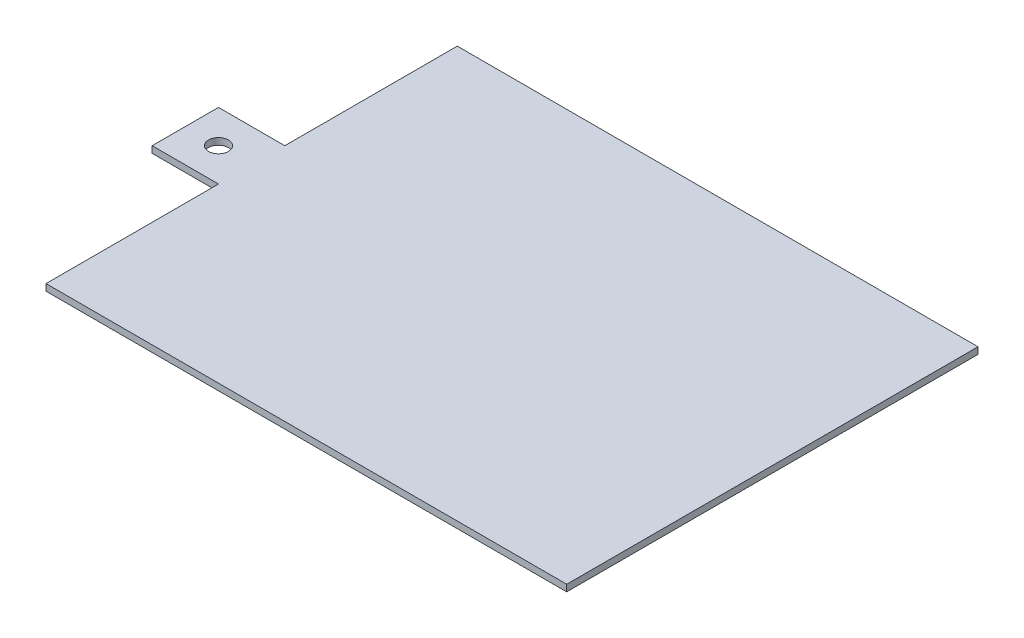
ISO-10303-21;
HEADER;
FILE_DESCRIPTION(('STEP AP214'),'2;1');
FILE_NAME('part.step','',(''),(''),'','','');
FILE_SCHEMA(('AUTOMOTIVE_DESIGN { 1 0 10303 214 1 1 1 1 }'));
ENDSEC;
DATA;
#1=APPLICATION_CONTEXT('core data for automotive mechanical design processes');
#2=APPLICATION_PROTOCOL_DEFINITION('international standard','automotive_design',2000,#1);
#3=PRODUCT_CONTEXT('',#1,'mechanical');
#4=PRODUCT('Part','Part','',(#3));
#5=PRODUCT_RELATED_PRODUCT_CATEGORY('part','',(#4));
#6=PRODUCT_DEFINITION_FORMATION('','',#4);
#7=PRODUCT_DEFINITION_CONTEXT('part definition',#1,'design');
#8=PRODUCT_DEFINITION('design','',#6,#7);
#9=PRODUCT_DEFINITION_SHAPE('','',#8);
#10=(LENGTH_UNIT() NAMED_UNIT(*) SI_UNIT(.MILLI.,.METRE.));
#11=(NAMED_UNIT(*) PLANE_ANGLE_UNIT() SI_UNIT($,.RADIAN.));
#12=(NAMED_UNIT(*) SI_UNIT($,.STERADIAN.) SOLID_ANGLE_UNIT());
#13=UNCERTAINTY_MEASURE_WITH_UNIT(LENGTH_MEASURE(1.E-05),#10,'distance_accuracy_value','');
#14=(GEOMETRIC_REPRESENTATION_CONTEXT(3) GLOBAL_UNCERTAINTY_ASSIGNED_CONTEXT((#13)) GLOBAL_UNIT_ASSIGNED_CONTEXT((#10,
#11,#12)) REPRESENTATION_CONTEXT('',''));
#15=CARTESIAN_POINT('',(0.,0.,0.));
#16=DIRECTION('',(0.,0.,1.));
#17=DIRECTION('',(1.,0.,0.));
#18=AXIS2_PLACEMENT_3D('',#15,#16,#17);
#19=CARTESIAN_POINT('',(0.,2.,0.));
#20=DIRECTION('',(0.,1.,0.));
#21=DIRECTION('',(0.,0.,1.));
#22=AXIS2_PLACEMENT_3D('',#19,#20,#21);
#23=PLANE('',#22);
#24=DIRECTION('',(0.,0.,-1.));
#25=VECTOR('',#24,1.);
#26=CARTESIAN_POINT('',(88.5,2.,-62.));
#27=LINE('',#26,#25);
#28=CARTESIAN_POINT('',(88.5,2.,62.));
#29=VERTEX_POINT('',#28);
#30=CARTESIAN_POINT('',(88.5,2.,-62.));
#31=VERTEX_POINT('',#30);
#32=EDGE_CURVE('E164',#29,#31,#27,.T.);
#33=ORIENTED_EDGE('',*,*,#32,.T.);
#34=DIRECTION('',(-1.,0.,0.));
#35=VECTOR('',#34,1.);
#36=CARTESIAN_POINT('',(-68.5,2.,-62.));
#37=LINE('',#36,#35);
#38=CARTESIAN_POINT('',(-68.5,2.,-62.));
#39=VERTEX_POINT('',#38);
#40=EDGE_CURVE('E100',#31,#39,#37,.T.);
#41=ORIENTED_EDGE('',*,*,#40,.T.);
#42=DIRECTION('',(0.,0.,1.));
#43=VECTOR('',#42,1.);
#44=CARTESIAN_POINT('',(-68.5,2.,-62.));
#45=LINE('',#44,#43);
#46=CARTESIAN_POINT('',(-68.5,2.,-10.));
#47=VERTEX_POINT('',#46);
#48=EDGE_CURVE('E185',#39,#47,#45,.T.);
#49=ORIENTED_EDGE('',*,*,#48,.T.);
#50=DIRECTION('',(-1.,0.,0.));
#51=VECTOR('',#50,1.);
#52=CARTESIAN_POINT('',(-88.5,2.,-10.));
#53=LINE('',#52,#51);
#54=CARTESIAN_POINT('',(-88.5,2.,-10.));
#55=VERTEX_POINT('',#54);
#56=EDGE_CURVE('E199',#47,#55,#53,.T.);
#57=ORIENTED_EDGE('',*,*,#56,.T.);
#58=DIRECTION('',(0.,0.,1.));
#59=VECTOR('',#58,1.);
#60=CARTESIAN_POINT('',(-88.5,2.,-10.));
#61=LINE('',#60,#59);
#62=CARTESIAN_POINT('',(-88.5,2.,10.));
#63=VERTEX_POINT('',#62);
#64=EDGE_CURVE('E119',#55,#63,#61,.T.);
#65=ORIENTED_EDGE('',*,*,#64,.T.);
#66=DIRECTION('',(1.,0.,0.));
#67=VECTOR('',#66,1.);
#68=CARTESIAN_POINT('',(-88.5,2.,10.));
#69=LINE('',#68,#67);
#70=CARTESIAN_POINT('',(-68.5,2.,10.));
#71=VERTEX_POINT('',#70);
#72=EDGE_CURVE('E113',#63,#71,#69,.T.);
#73=ORIENTED_EDGE('',*,*,#72,.T.);
#74=DIRECTION('',(0.,0.,1.));
#75=VECTOR('',#74,1.);
#76=CARTESIAN_POINT('',(-68.5,2.,62.));
#77=LINE('',#76,#75);
#78=CARTESIAN_POINT('',(-68.5,2.,62.));
#79=VERTEX_POINT('',#78);
#80=EDGE_CURVE('E117',#71,#79,#77,.T.);
#81=ORIENTED_EDGE('',*,*,#80,.T.);
#82=DIRECTION('',(1.,0.,0.));
#83=VECTOR('',#82,1.);
#84=CARTESIAN_POINT('',(-68.5,2.,62.));
#85=LINE('',#84,#83);
#86=EDGE_CURVE('E57',#79,#29,#85,.T.);
#87=ORIENTED_EDGE('',*,*,#86,.T.);
#88=EDGE_LOOP('',(#33,#41,#49,#57,#65,#73,#81,#87));
#89=FACE_BOUND('',#88,.T.);
#90=CARTESIAN_POINT('',(-78.5,2.,0.));
#91=DIRECTION('',(0.,1.,0.));
#92=DIRECTION('',(0.,0.,1.));
#93=AXIS2_PLACEMENT_3D('',#90,#91,#92);
#94=CIRCLE('',#93,3.00000000000001);
#95=CARTESIAN_POINT('',(-78.5,2.,3.00000000000001));
#96=VERTEX_POINT('',#95);
#97=EDGE_CURVE('E146',#96,#96,#94,.T.);
#98=ORIENTED_EDGE('',*,*,#97,.F.);
#99=EDGE_LOOP('',(#98));
#100=FACE_BOUND('',#99,.T.);
#101=ADVANCED_FACE('F39',(#89,#100),#23,.T.);
#102=CARTESIAN_POINT('',(0.,0.,0.));
#103=DIRECTION('',(0.,1.,0.));
#104=DIRECTION('',(0.,0.,1.));
#105=AXIS2_PLACEMENT_3D('',#102,#103,#104);
#106=PLANE('',#105);
#107=DIRECTION('',(0.,0.,-1.));
#108=VECTOR('',#107,1.);
#109=CARTESIAN_POINT('',(88.5,0.,-62.));
#110=LINE('',#109,#108);
#111=CARTESIAN_POINT('',(88.5,0.,62.));
#112=VERTEX_POINT('',#111);
#113=CARTESIAN_POINT('',(88.5,0.,-62.));
#114=VERTEX_POINT('',#113);
#115=EDGE_CURVE('E141',#112,#114,#110,.T.);
#116=ORIENTED_EDGE('',*,*,#115,.F.);
#117=DIRECTION('',(1.,0.,0.));
#118=VECTOR('',#117,1.);
#119=CARTESIAN_POINT('',(-68.5,0.,62.));
#120=LINE('',#119,#118);
#121=CARTESIAN_POINT('',(-68.5,0.,62.));
#122=VERTEX_POINT('',#121);
#123=EDGE_CURVE('E92',#122,#112,#120,.T.);
#124=ORIENTED_EDGE('',*,*,#123,.F.);
#125=DIRECTION('',(0.,0.,1.));
#126=VECTOR('',#125,1.);
#127=CARTESIAN_POINT('',(-68.5,0.,62.));
#128=LINE('',#127,#126);
#129=CARTESIAN_POINT('',(-68.5,0.,10.));
#130=VERTEX_POINT('',#129);
#131=EDGE_CURVE('E86',#130,#122,#128,.T.);
#132=ORIENTED_EDGE('',*,*,#131,.F.);
#133=DIRECTION('',(1.,0.,0.));
#134=VECTOR('',#133,1.);
#135=CARTESIAN_POINT('',(-88.5,0.,10.));
#136=LINE('',#135,#134);
#137=CARTESIAN_POINT('',(-88.5,0.,10.));
#138=VERTEX_POINT('',#137);
#139=EDGE_CURVE('E128',#138,#130,#136,.T.);
#140=ORIENTED_EDGE('',*,*,#139,.F.);
#141=DIRECTION('',(0.,0.,1.));
#142=VECTOR('',#141,1.);
#143=CARTESIAN_POINT('',(-88.5,0.,-10.));
#144=LINE('',#143,#142);
#145=CARTESIAN_POINT('',(-88.5,0.,-10.));
#146=VERTEX_POINT('',#145);
#147=EDGE_CURVE('E155',#146,#138,#144,.T.);
#148=ORIENTED_EDGE('',*,*,#147,.F.);
#149=DIRECTION('',(-1.,0.,0.));
#150=VECTOR('',#149,1.);
#151=CARTESIAN_POINT('',(-88.5,0.,-10.));
#152=LINE('',#151,#150);
#153=CARTESIAN_POINT('',(-68.5,0.,-10.));
#154=VERTEX_POINT('',#153);
#155=EDGE_CURVE('E152',#154,#146,#152,.T.);
#156=ORIENTED_EDGE('',*,*,#155,.F.);
#157=DIRECTION('',(0.,0.,1.));
#158=VECTOR('',#157,1.);
#159=CARTESIAN_POINT('',(-68.5,0.,-62.));
#160=LINE('',#159,#158);
#161=CARTESIAN_POINT('',(-68.5,0.,-62.));
#162=VERTEX_POINT('',#161);
#163=EDGE_CURVE('E149',#162,#154,#160,.T.);
#164=ORIENTED_EDGE('',*,*,#163,.F.);
#165=DIRECTION('',(-1.,0.,0.));
#166=VECTOR('',#165,1.);
#167=CARTESIAN_POINT('',(-68.5,0.,-62.));
#168=LINE('',#167,#166);
#169=EDGE_CURVE('E145',#114,#162,#168,.T.);
#170=ORIENTED_EDGE('',*,*,#169,.F.);
#171=EDGE_LOOP('',(#116,#124,#132,#140,#148,#156,#164,#170));
#172=FACE_BOUND('',#171,.T.);
#173=CARTESIAN_POINT('',(-78.5,0.,0.));
#174=DIRECTION('',(0.,1.,0.));
#175=DIRECTION('',(0.,0.,1.));
#176=AXIS2_PLACEMENT_3D('',#173,#174,#175);
#177=CIRCLE('',#176,3.00000000000001);
#178=CARTESIAN_POINT('',(-78.5,0.,3.00000000000001));
#179=VERTEX_POINT('',#178);
#180=EDGE_CURVE('E209',#179,#179,#177,.T.);
#181=ORIENTED_EDGE('',*,*,#180,.T.);
#182=EDGE_LOOP('',(#181));
#183=FACE_BOUND('',#182,.T.);
#184=ADVANCED_FACE('F189',(#172,#183),#106,.F.);
#185=CARTESIAN_POINT('',(88.5,2.,-62.));
#186=DIRECTION('',(-1.,0.,0.));
#187=DIRECTION('',(0.,0.,1.));
#188=AXIS2_PLACEMENT_3D('',#185,#186,#187);
#189=PLANE('',#188);
#190=ORIENTED_EDGE('',*,*,#115,.T.);
#191=DIRECTION('',(0.,-1.,0.));
#192=VECTOR('',#191,1.);
#193=CARTESIAN_POINT('',(88.5,2.,-62.));
#194=LINE('',#193,#192);
#195=EDGE_CURVE('E11',#31,#114,#194,.T.);
#196=ORIENTED_EDGE('',*,*,#195,.F.);
#197=ORIENTED_EDGE('',*,*,#32,.F.);
#198=DIRECTION('',(0.,-1.,0.));
#199=VECTOR('',#198,1.);
#200=CARTESIAN_POINT('',(88.5,2.,62.));
#201=LINE('',#200,#199);
#202=EDGE_CURVE('E137',#29,#112,#201,.T.);
#203=ORIENTED_EDGE('',*,*,#202,.T.);
#204=EDGE_LOOP('',(#190,#196,#197,#203));
#205=FACE_BOUND('',#204,.T.);
#206=ADVANCED_FACE('F41',(#205),#189,.F.);
#207=CARTESIAN_POINT('',(-68.5,2.,-62.));
#208=DIRECTION('',(0.,0.,1.));
#209=DIRECTION('',(1.,0.,0.));
#210=AXIS2_PLACEMENT_3D('',#207,#208,#209);
#211=PLANE('',#210);
#212=ORIENTED_EDGE('',*,*,#169,.T.);
#213=DIRECTION('',(0.,-1.,0.));
#214=VECTOR('',#213,1.);
#215=CARTESIAN_POINT('',(-68.5,2.,-62.));
#216=LINE('',#215,#214);
#217=EDGE_CURVE('E49',#39,#162,#216,.T.);
#218=ORIENTED_EDGE('',*,*,#217,.F.);
#219=ORIENTED_EDGE('',*,*,#40,.F.);
#220=ORIENTED_EDGE('',*,*,#195,.T.);
#221=EDGE_LOOP('',(#212,#218,#219,#220));
#222=FACE_BOUND('',#221,.T.);
#223=ADVANCED_FACE('F239',(#222),#211,.F.);
#224=CARTESIAN_POINT('',(-68.5,2.,-62.));
#225=DIRECTION('',(1.,0.,0.));
#226=DIRECTION('',(0.,0.,-1.));
#227=AXIS2_PLACEMENT_3D('',#224,#225,#226);
#228=PLANE('',#227);
#229=ORIENTED_EDGE('',*,*,#163,.T.);
#230=DIRECTION('',(0.,-1.,0.));
#231=VECTOR('',#230,1.);
#232=CARTESIAN_POINT('',(-68.5,2.,-10.));
#233=LINE('',#232,#231);
#234=EDGE_CURVE('E175',#47,#154,#233,.T.);
#235=ORIENTED_EDGE('',*,*,#234,.F.);
#236=ORIENTED_EDGE('',*,*,#48,.F.);
#237=ORIENTED_EDGE('',*,*,#217,.T.);
#238=EDGE_LOOP('',(#229,#235,#236,#237));
#239=FACE_BOUND('',#238,.T.);
#240=ADVANCED_FACE('F183',(#239),#228,.F.);
#241=CARTESIAN_POINT('',(-88.5,2.,-10.));
#242=DIRECTION('',(0.,0.,1.));
#243=DIRECTION('',(1.,0.,0.));
#244=AXIS2_PLACEMENT_3D('',#241,#242,#243);
#245=PLANE('',#244);
#246=ORIENTED_EDGE('',*,*,#155,.T.);
#247=DIRECTION('',(0.,-1.,0.));
#248=VECTOR('',#247,1.);
#249=CARTESIAN_POINT('',(-88.5,2.,-10.));
#250=LINE('',#249,#248);
#251=EDGE_CURVE('E171',#55,#146,#250,.T.);
#252=ORIENTED_EDGE('',*,*,#251,.F.);
#253=ORIENTED_EDGE('',*,*,#56,.F.);
#254=ORIENTED_EDGE('',*,*,#234,.T.);
#255=EDGE_LOOP('',(#246,#252,#253,#254));
#256=FACE_BOUND('',#255,.T.);
#257=ADVANCED_FACE('F194',(#256),#245,.F.);
#258=CARTESIAN_POINT('',(-88.5,2.,-10.));
#259=DIRECTION('',(1.,0.,0.));
#260=DIRECTION('',(0.,0.,-1.));
#261=AXIS2_PLACEMENT_3D('',#258,#259,#260);
#262=PLANE('',#261);
#263=ORIENTED_EDGE('',*,*,#147,.T.);
#264=DIRECTION('',(0.,-1.,0.));
#265=VECTOR('',#264,1.);
#266=CARTESIAN_POINT('',(-88.5,2.,10.));
#267=LINE('',#266,#265);
#268=EDGE_CURVE('E130',#63,#138,#267,.T.);
#269=ORIENTED_EDGE('',*,*,#268,.F.);
#270=ORIENTED_EDGE('',*,*,#64,.F.);
#271=ORIENTED_EDGE('',*,*,#251,.T.);
#272=EDGE_LOOP('',(#263,#269,#270,#271));
#273=FACE_BOUND('',#272,.T.);
#274=ADVANCED_FACE('F197',(#273),#262,.F.);
#275=CARTESIAN_POINT('',(-88.5,2.,10.));
#276=DIRECTION('',(0.,0.,-1.));
#277=DIRECTION('',(-1.,0.,0.));
#278=AXIS2_PLACEMENT_3D('',#275,#276,#277);
#279=PLANE('',#278);
#280=ORIENTED_EDGE('',*,*,#139,.T.);
#281=DIRECTION('',(0.,-1.,0.));
#282=VECTOR('',#281,1.);
#283=CARTESIAN_POINT('',(-68.5,2.,10.));
#284=LINE('',#283,#282);
#285=EDGE_CURVE('E125',#71,#130,#284,.T.);
#286=ORIENTED_EDGE('',*,*,#285,.F.);
#287=ORIENTED_EDGE('',*,*,#72,.F.);
#288=ORIENTED_EDGE('',*,*,#268,.T.);
#289=EDGE_LOOP('',(#280,#286,#287,#288));
#290=FACE_BOUND('',#289,.T.);
#291=ADVANCED_FACE('F126',(#290),#279,.F.);
#292=CARTESIAN_POINT('',(-68.5,2.,62.));
#293=DIRECTION('',(1.,0.,0.));
#294=DIRECTION('',(0.,0.,-1.));
#295=AXIS2_PLACEMENT_3D('',#292,#293,#294);
#296=PLANE('',#295);
#297=ORIENTED_EDGE('',*,*,#131,.T.);
#298=DIRECTION('',(0.,-1.,0.));
#299=VECTOR('',#298,1.);
#300=CARTESIAN_POINT('',(-68.5,2.,62.));
#301=LINE('',#300,#299);
#302=EDGE_CURVE('E131',#79,#122,#301,.T.);
#303=ORIENTED_EDGE('',*,*,#302,.F.);
#304=ORIENTED_EDGE('',*,*,#80,.F.);
#305=ORIENTED_EDGE('',*,*,#285,.T.);
#306=EDGE_LOOP('',(#297,#303,#304,#305));
#307=FACE_BOUND('',#306,.T.);
#308=ADVANCED_FACE('F133',(#307),#296,.F.);
#309=CARTESIAN_POINT('',(-68.5,2.,62.));
#310=DIRECTION('',(0.,0.,-1.));
#311=DIRECTION('',(-1.,0.,0.));
#312=AXIS2_PLACEMENT_3D('',#309,#310,#311);
#313=PLANE('',#312);
#314=ORIENTED_EDGE('',*,*,#123,.T.);
#315=ORIENTED_EDGE('',*,*,#202,.F.);
#316=ORIENTED_EDGE('',*,*,#86,.F.);
#317=ORIENTED_EDGE('',*,*,#302,.T.);
#318=EDGE_LOOP('',(#314,#315,#316,#317));
#319=FACE_BOUND('',#318,.T.);
#320=ADVANCED_FACE('F227',(#319),#313,.F.);
#321=CARTESIAN_POINT('',(-78.5,2.,0.));
#322=DIRECTION('',(0.,-1.,0.));
#323=DIRECTION('',(0.,0.,-1.));
#324=AXIS2_PLACEMENT_3D('',#321,#322,#323);
#325=CYLINDRICAL_SURFACE('',#324,3.00000000000001);
#326=ORIENTED_EDGE('',*,*,#97,.T.);
#327=EDGE_LOOP('',(#326));
#328=FACE_BOUND('',#327,.T.);
#329=ORIENTED_EDGE('',*,*,#180,.F.);
#330=EDGE_LOOP('',(#329));
#331=FACE_BOUND('',#330,.T.);
#332=ADVANCED_FACE('F217',(#328,#331),#325,.F.);
#333=CLOSED_SHELL('',(#101,#184,#206,#223,#240,#257,#274,#291,#308,#320,#332));
#334=MANIFOLD_SOLID_BREP('B2',#333);
#335=ADVANCED_BREP_SHAPE_REPRESENTATION('',(#18,#334),#14);
#336=SHAPE_DEFINITION_REPRESENTATION(#9,#335);
ENDSEC;
END-ISO-10303-21;
